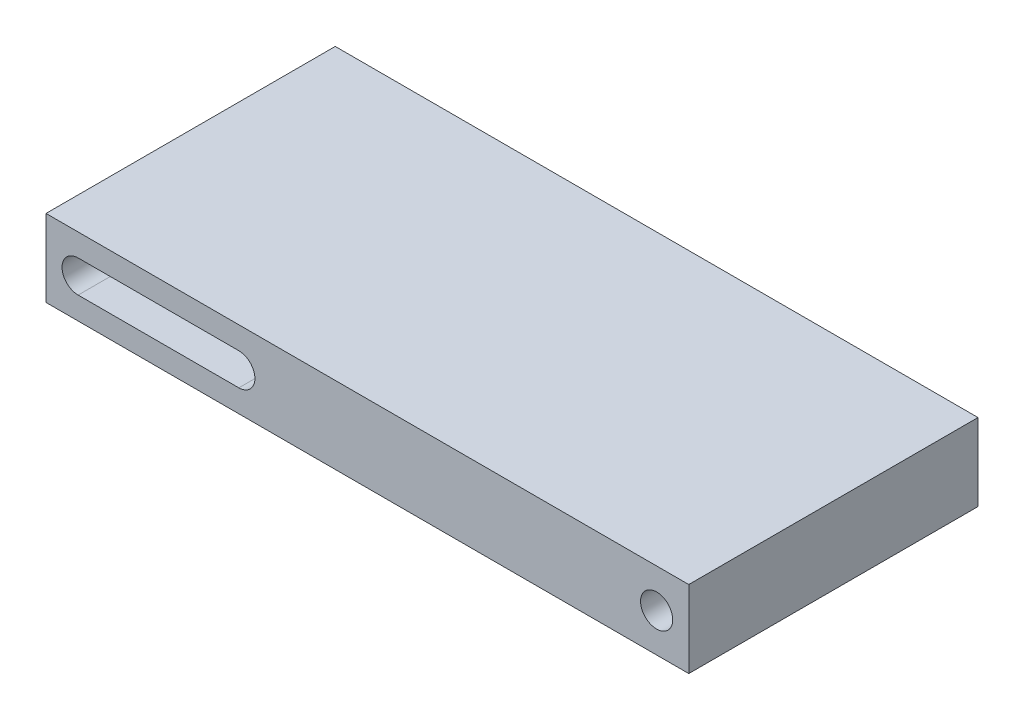
ISO-10303-21;
HEADER;
FILE_DESCRIPTION(('STEP AP214'),'2;1');
FILE_NAME('part.step','',(''),(''),'','','');
FILE_SCHEMA(('AUTOMOTIVE_DESIGN { 1 0 10303 214 1 1 1 1 }'));
ENDSEC;
DATA;
#1=APPLICATION_CONTEXT('core data for automotive mechanical design processes');
#2=APPLICATION_PROTOCOL_DEFINITION('international standard','automotive_design',2000,#1);
#3=PRODUCT_CONTEXT('',#1,'mechanical');
#4=PRODUCT('Part','Part','',(#3));
#5=PRODUCT_RELATED_PRODUCT_CATEGORY('part','',(#4));
#6=PRODUCT_DEFINITION_FORMATION('','',#4);
#7=PRODUCT_DEFINITION_CONTEXT('part definition',#1,'design');
#8=PRODUCT_DEFINITION('design','',#6,#7);
#9=PRODUCT_DEFINITION_SHAPE('','',#8);
#10=(LENGTH_UNIT() NAMED_UNIT(*) SI_UNIT(.MILLI.,.METRE.));
#11=(NAMED_UNIT(*) PLANE_ANGLE_UNIT() SI_UNIT($,.RADIAN.));
#12=(NAMED_UNIT(*) SI_UNIT($,.STERADIAN.) SOLID_ANGLE_UNIT());
#13=UNCERTAINTY_MEASURE_WITH_UNIT(LENGTH_MEASURE(1.E-05),#10,'distance_accuracy_value','');
#14=(GEOMETRIC_REPRESENTATION_CONTEXT(3) GLOBAL_UNCERTAINTY_ASSIGNED_CONTEXT((#13)) GLOBAL_UNIT_ASSIGNED_CONTEXT((#10,
#11,#12)) REPRESENTATION_CONTEXT('',''));
#15=CARTESIAN_POINT('',(0.,0.,0.));
#16=DIRECTION('',(0.,0.,1.));
#17=DIRECTION('',(1.,0.,0.));
#18=AXIS2_PLACEMENT_3D('',#15,#16,#17);
#19=CARTESIAN_POINT('',(50.,6.,-22.5));
#20=DIRECTION('',(-1.,0.,0.));
#21=DIRECTION('',(0.,0.,1.));
#22=AXIS2_PLACEMENT_3D('',#19,#20,#21);
#23=PLANE('',#22);
#24=DIRECTION('',(0.,0.,-1.));
#25=VECTOR('',#24,1.);
#26=CARTESIAN_POINT('',(50.,-6.,-22.5));
#27=LINE('',#26,#25);
#28=CARTESIAN_POINT('',(50.,-6.,22.5));
#29=VERTEX_POINT('',#28);
#30=CARTESIAN_POINT('',(50.,-6.,-22.5));
#31=VERTEX_POINT('',#30);
#32=EDGE_CURVE('E152',#29,#31,#27,.T.);
#33=ORIENTED_EDGE('',*,*,#32,.T.);
#34=DIRECTION('',(0.,-1.,0.));
#35=VECTOR('',#34,1.);
#36=CARTESIAN_POINT('',(50.,6.,-22.5));
#37=LINE('',#36,#35);
#38=CARTESIAN_POINT('',(50.,6.,-22.5));
#39=VERTEX_POINT('',#38);
#40=EDGE_CURVE('E11',#39,#31,#37,.T.);
#41=ORIENTED_EDGE('',*,*,#40,.F.);
#42=DIRECTION('',(0.,0.,-1.));
#43=VECTOR('',#42,1.);
#44=CARTESIAN_POINT('',(50.,6.,-22.5));
#45=LINE('',#44,#43);
#46=CARTESIAN_POINT('',(50.,6.,22.5));
#47=VERTEX_POINT('',#46);
#48=EDGE_CURVE('E165',#47,#39,#45,.T.);
#49=ORIENTED_EDGE('',*,*,#48,.F.);
#50=DIRECTION('',(0.,-1.,0.));
#51=VECTOR('',#50,1.);
#52=CARTESIAN_POINT('',(50.,6.,22.5));
#53=LINE('',#52,#51);
#54=EDGE_CURVE('E179',#47,#29,#53,.T.);
#55=ORIENTED_EDGE('',*,*,#54,.T.);
#56=EDGE_LOOP('',(#33,#41,#49,#55));
#57=FACE_BOUND('',#56,.T.);
#58=ADVANCED_FACE('F43',(#57),#23,.F.);
#59=CARTESIAN_POINT('',(-50.,6.,-22.5));
#60=DIRECTION('',(0.,0.,1.));
#61=DIRECTION('',(1.,0.,0.));
#62=AXIS2_PLACEMENT_3D('',#59,#60,#61);
#63=PLANE('',#62);
#64=DIRECTION('',(-1.,0.,0.));
#65=VECTOR('',#64,1.);
#66=CARTESIAN_POINT('',(-45.,2.5,-22.5));
#67=LINE('',#66,#65);
#68=CARTESIAN_POINT('',(-20.,2.5,-22.5));
#69=VERTEX_POINT('',#68);
#70=CARTESIAN_POINT('',(-45.,2.5,-22.5));
#71=VERTEX_POINT('',#70);
#72=EDGE_CURVE('E117',#69,#71,#67,.T.);
#73=ORIENTED_EDGE('',*,*,#72,.T.);
#74=CARTESIAN_POINT('',(-45.,0.,-22.5));
#75=DIRECTION('',(0.,0.,1.));
#76=DIRECTION('',(1.,0.,0.));
#77=AXIS2_PLACEMENT_3D('',#74,#75,#76);
#78=CIRCLE('',#77,2.5);
#79=CARTESIAN_POINT('',(-45.,-2.5,-22.5));
#80=VERTEX_POINT('',#79);
#81=EDGE_CURVE('E110',#71,#80,#78,.T.);
#82=ORIENTED_EDGE('',*,*,#81,.T.);
#83=DIRECTION('',(1.,0.,0.));
#84=VECTOR('',#83,1.);
#85=CARTESIAN_POINT('',(-45.,-2.5,-22.5));
#86=LINE('',#85,#84);
#87=CARTESIAN_POINT('',(-20.,-2.5,-22.5));
#88=VERTEX_POINT('',#87);
#89=EDGE_CURVE('E120',#80,#88,#86,.T.);
#90=ORIENTED_EDGE('',*,*,#89,.T.);
#91=CARTESIAN_POINT('',(-20.,0.,-22.5));
#92=DIRECTION('',(0.,0.,1.));
#93=DIRECTION('',(1.,0.,0.));
#94=AXIS2_PLACEMENT_3D('',#91,#92,#93);
#95=CIRCLE('',#94,2.5);
#96=EDGE_CURVE('E58',#88,#69,#95,.T.);
#97=ORIENTED_EDGE('',*,*,#96,.T.);
#98=EDGE_LOOP('',(#73,#82,#90,#97));
#99=FACE_BOUND('',#98,.T.);
#100=CARTESIAN_POINT('',(45.,0.,-22.5));
#101=DIRECTION('',(0.,0.,1.));
#102=DIRECTION('',(1.,0.,0.));
#103=AXIS2_PLACEMENT_3D('',#100,#101,#102);
#104=CIRCLE('',#103,2.5);
#105=CARTESIAN_POINT('',(47.5,0.,-22.5));
#106=VERTEX_POINT('',#105);
#107=EDGE_CURVE('E161',#106,#106,#104,.T.);
#108=ORIENTED_EDGE('',*,*,#107,.T.);
#109=EDGE_LOOP('',(#108));
#110=FACE_BOUND('',#109,.T.);
#111=DIRECTION('',(-1.,0.,0.));
#112=VECTOR('',#111,1.);
#113=CARTESIAN_POINT('',(-50.,-6.,-22.5));
#114=LINE('',#113,#112);
#115=CARTESIAN_POINT('',(-50.,-6.,-22.5));
#116=VERTEX_POINT('',#115);
#117=EDGE_CURVE('E183',#31,#116,#114,.T.);
#118=ORIENTED_EDGE('',*,*,#117,.T.);
#119=DIRECTION('',(0.,-1.,0.));
#120=VECTOR('',#119,1.);
#121=CARTESIAN_POINT('',(-50.,6.,-22.5));
#122=LINE('',#121,#120);
#123=CARTESIAN_POINT('',(-50.,6.,-22.5));
#124=VERTEX_POINT('',#123);
#125=EDGE_CURVE('E51',#124,#116,#122,.T.);
#126=ORIENTED_EDGE('',*,*,#125,.F.);
#127=DIRECTION('',(-1.,0.,0.));
#128=VECTOR('',#127,1.);
#129=CARTESIAN_POINT('',(-50.,6.,-22.5));
#130=LINE('',#129,#128);
#131=EDGE_CURVE('E169',#39,#124,#130,.T.);
#132=ORIENTED_EDGE('',*,*,#131,.F.);
#133=ORIENTED_EDGE('',*,*,#40,.T.);
#134=EDGE_LOOP('',(#118,#126,#132,#133));
#135=FACE_BOUND('',#134,.T.);
#136=ADVANCED_FACE('F125',(#99,#110,#135),#63,.F.);
#137=CARTESIAN_POINT('',(-50.,6.,-22.5));
#138=DIRECTION('',(1.,0.,0.));
#139=DIRECTION('',(0.,0.,-1.));
#140=AXIS2_PLACEMENT_3D('',#137,#138,#139);
#141=PLANE('',#140);
#142=DIRECTION('',(0.,0.,1.));
#143=VECTOR('',#142,1.);
#144=CARTESIAN_POINT('',(-50.,-6.,-22.5));
#145=LINE('',#144,#143);
#146=CARTESIAN_POINT('',(-50.,-6.,22.5));
#147=VERTEX_POINT('',#146);
#148=EDGE_CURVE('E186',#116,#147,#145,.T.);
#149=ORIENTED_EDGE('',*,*,#148,.T.);
#150=DIRECTION('',(0.,-1.,0.));
#151=VECTOR('',#150,1.);
#152=CARTESIAN_POINT('',(-50.,6.,22.5));
#153=LINE('',#152,#151);
#154=CARTESIAN_POINT('',(-50.,6.,22.5));
#155=VERTEX_POINT('',#154);
#156=EDGE_CURVE('E194',#155,#147,#153,.T.);
#157=ORIENTED_EDGE('',*,*,#156,.F.);
#158=DIRECTION('',(0.,0.,1.));
#159=VECTOR('',#158,1.);
#160=CARTESIAN_POINT('',(-50.,6.,-22.5));
#161=LINE('',#160,#159);
#162=EDGE_CURVE('E173',#124,#155,#161,.T.);
#163=ORIENTED_EDGE('',*,*,#162,.F.);
#164=ORIENTED_EDGE('',*,*,#125,.T.);
#165=EDGE_LOOP('',(#149,#157,#163,#164));
#166=FACE_BOUND('',#165,.T.);
#167=ADVANCED_FACE('F203',(#166),#141,.F.);
#168=CARTESIAN_POINT('',(-50.,6.,22.5));
#169=DIRECTION('',(0.,0.,-1.));
#170=DIRECTION('',(-1.,0.,0.));
#171=AXIS2_PLACEMENT_3D('',#168,#169,#170);
#172=PLANE('',#171);
#173=DIRECTION('',(1.,0.,0.));
#174=VECTOR('',#173,1.);
#175=CARTESIAN_POINT('',(-45.,-2.5,22.5));
#176=LINE('',#175,#174);
#177=CARTESIAN_POINT('',(-45.,-2.5,22.5));
#178=VERTEX_POINT('',#177);
#179=CARTESIAN_POINT('',(-20.,-2.5,22.5));
#180=VERTEX_POINT('',#179);
#181=EDGE_CURVE('E142',#178,#180,#176,.T.);
#182=ORIENTED_EDGE('',*,*,#181,.F.);
#183=CARTESIAN_POINT('',(-45.,0.,22.5));
#184=DIRECTION('',(0.,0.,1.));
#185=DIRECTION('',(1.,0.,0.));
#186=AXIS2_PLACEMENT_3D('',#183,#184,#185);
#187=CIRCLE('',#186,2.5);
#188=CARTESIAN_POINT('',(-45.,2.5,22.5));
#189=VERTEX_POINT('',#188);
#190=EDGE_CURVE('E66',#189,#178,#187,.T.);
#191=ORIENTED_EDGE('',*,*,#190,.F.);
#192=DIRECTION('',(-1.,0.,0.));
#193=VECTOR('',#192,1.);
#194=CARTESIAN_POINT('',(-45.,2.5,22.5));
#195=LINE('',#194,#193);
#196=CARTESIAN_POINT('',(-20.,2.5,22.5));
#197=VERTEX_POINT('',#196);
#198=EDGE_CURVE('E129',#197,#189,#195,.T.);
#199=ORIENTED_EDGE('',*,*,#198,.F.);
#200=CARTESIAN_POINT('',(-20.,0.,22.5));
#201=DIRECTION('',(0.,0.,1.));
#202=DIRECTION('',(1.,0.,0.));
#203=AXIS2_PLACEMENT_3D('',#200,#201,#202);
#204=CIRCLE('',#203,2.5);
#205=EDGE_CURVE('E133',#180,#197,#204,.T.);
#206=ORIENTED_EDGE('',*,*,#205,.F.);
#207=EDGE_LOOP('',(#182,#191,#199,#206));
#208=FACE_BOUND('',#207,.T.);
#209=CARTESIAN_POINT('',(45.,0.,22.5));
#210=DIRECTION('',(0.,0.,1.));
#211=DIRECTION('',(1.,0.,0.));
#212=AXIS2_PLACEMENT_3D('',#209,#210,#211);
#213=CIRCLE('',#212,2.5);
#214=CARTESIAN_POINT('',(47.5,0.,22.5));
#215=VERTEX_POINT('',#214);
#216=EDGE_CURVE('E143',#215,#215,#213,.T.);
#217=ORIENTED_EDGE('',*,*,#216,.F.);
#218=EDGE_LOOP('',(#217));
#219=FACE_BOUND('',#218,.T.);
#220=DIRECTION('',(1.,0.,0.));
#221=VECTOR('',#220,1.);
#222=CARTESIAN_POINT('',(-50.,-6.,22.5));
#223=LINE('',#222,#221);
#224=EDGE_CURVE('E170',#147,#29,#223,.T.);
#225=ORIENTED_EDGE('',*,*,#224,.T.);
#226=ORIENTED_EDGE('',*,*,#54,.F.);
#227=DIRECTION('',(1.,0.,0.));
#228=VECTOR('',#227,1.);
#229=CARTESIAN_POINT('',(-50.,6.,22.5));
#230=LINE('',#229,#228);
#231=EDGE_CURVE('E176',#155,#47,#230,.T.);
#232=ORIENTED_EDGE('',*,*,#231,.F.);
#233=ORIENTED_EDGE('',*,*,#156,.T.);
#234=EDGE_LOOP('',(#225,#226,#232,#233));
#235=FACE_BOUND('',#234,.T.);
#236=ADVANCED_FACE('F212',(#208,#219,#235),#172,.F.);
#237=CARTESIAN_POINT('',(0.,6.,0.));
#238=DIRECTION('',(0.,1.,0.));
#239=DIRECTION('',(0.,0.,1.));
#240=AXIS2_PLACEMENT_3D('',#237,#238,#239);
#241=PLANE('',#240);
#242=ORIENTED_EDGE('',*,*,#48,.T.);
#243=ORIENTED_EDGE('',*,*,#131,.T.);
#244=ORIENTED_EDGE('',*,*,#162,.T.);
#245=ORIENTED_EDGE('',*,*,#231,.T.);
#246=EDGE_LOOP('',(#242,#243,#244,#245));
#247=FACE_BOUND('',#246,.T.);
#248=ADVANCED_FACE('F218',(#247),#241,.T.);
#249=CARTESIAN_POINT('',(0.,-6.,0.));
#250=DIRECTION('',(0.,1.,0.));
#251=DIRECTION('',(0.,0.,1.));
#252=AXIS2_PLACEMENT_3D('',#249,#250,#251);
#253=PLANE('',#252);
#254=ORIENTED_EDGE('',*,*,#32,.F.);
#255=ORIENTED_EDGE('',*,*,#224,.F.);
#256=ORIENTED_EDGE('',*,*,#148,.F.);
#257=ORIENTED_EDGE('',*,*,#117,.F.);
#258=EDGE_LOOP('',(#254,#255,#256,#257));
#259=FACE_BOUND('',#258,.T.);
#260=ADVANCED_FACE('F209',(#259),#253,.F.);
#261=CARTESIAN_POINT('',(45.,0.,-22.5));
#262=DIRECTION('',(0.,0.,1.));
#263=DIRECTION('',(1.,0.,0.));
#264=AXIS2_PLACEMENT_3D('',#261,#262,#263);
#265=CYLINDRICAL_SURFACE('',#264,2.5);
#266=CARTESIAN_POINT('',(47.5,0.,-22.5));
#267=CARTESIAN_POINT('',(47.5,0.,-22.03125));
#268=CARTESIAN_POINT('',(47.5,0.,-21.5625));
#269=CARTESIAN_POINT('',(47.5,0.,-20.625));
#270=CARTESIAN_POINT('',(47.5,0.,-20.15625));
#271=CARTESIAN_POINT('',(47.5,0.,-19.21875));
#272=CARTESIAN_POINT('',(47.5,0.,-18.75));
#273=CARTESIAN_POINT('',(47.5,0.,-17.8125));
#274=CARTESIAN_POINT('',(47.5,0.,-17.34375));
#275=CARTESIAN_POINT('',(47.5,0.,-16.40625));
#276=CARTESIAN_POINT('',(47.5,0.,-15.9375));
#277=CARTESIAN_POINT('',(47.5,0.,-15.));
#278=CARTESIAN_POINT('',(47.5,0.,-14.53125));
#279=CARTESIAN_POINT('',(47.5,0.,-13.59375));
#280=CARTESIAN_POINT('',(47.5,0.,-13.125));
#281=CARTESIAN_POINT('',(47.5,0.,-12.1875));
#282=CARTESIAN_POINT('',(47.5,0.,-11.71875));
#283=CARTESIAN_POINT('',(47.5,0.,-10.78125));
#284=CARTESIAN_POINT('',(47.5,0.,-10.3125));
#285=CARTESIAN_POINT('',(47.5,0.,-9.37500000000001));
#286=CARTESIAN_POINT('',(47.5,0.,-8.90625000000001));
#287=CARTESIAN_POINT('',(47.5,0.,-7.96875000000001));
#288=CARTESIAN_POINT('',(47.5,0.,-7.50000000000001));
#289=CARTESIAN_POINT('',(47.5,0.,-6.56250000000001));
#290=CARTESIAN_POINT('',(47.5,0.,-6.09375000000001));
#291=CARTESIAN_POINT('',(47.5,0.,-5.15625000000001));
#292=CARTESIAN_POINT('',(47.5,0.,-4.68750000000001));
#293=CARTESIAN_POINT('',(47.5,0.,-3.75000000000001));
#294=CARTESIAN_POINT('',(47.5,0.,-3.28125000000001));
#295=CARTESIAN_POINT('',(47.5,0.,-2.34375000000001));
#296=CARTESIAN_POINT('',(47.5,0.,-1.87500000000001));
#297=CARTESIAN_POINT('',(47.5,0.,-0.937500000000011));
#298=CARTESIAN_POINT('',(47.5,0.,-0.468750000000011));
#299=CARTESIAN_POINT('',(47.5,0.,0.46874999999999));
#300=CARTESIAN_POINT('',(47.5,0.,0.93749999999999));
#301=CARTESIAN_POINT('',(47.5,0.,1.87499999999999));
#302=CARTESIAN_POINT('',(47.5,0.,2.34374999999999));
#303=CARTESIAN_POINT('',(47.5,0.,3.28124999999999));
#304=CARTESIAN_POINT('',(47.5,0.,3.74999999999999));
#305=CARTESIAN_POINT('',(47.5,0.,4.68749999999999));
#306=CARTESIAN_POINT('',(47.5,0.,5.15624999999999));
#307=CARTESIAN_POINT('',(47.5,0.,6.09374999999999));
#308=CARTESIAN_POINT('',(47.5,0.,6.56249999999999));
#309=CARTESIAN_POINT('',(47.5,0.,7.49999999999999));
#310=CARTESIAN_POINT('',(47.5,0.,7.96874999999999));
#311=CARTESIAN_POINT('',(47.5,0.,8.90624999999999));
#312=CARTESIAN_POINT('',(47.5,0.,9.37499999999999));
#313=CARTESIAN_POINT('',(47.5,0.,10.3125));
#314=CARTESIAN_POINT('',(47.5,0.,10.78125));
#315=CARTESIAN_POINT('',(47.5,0.,11.71875));
#316=CARTESIAN_POINT('',(47.5,0.,12.1875));
#317=CARTESIAN_POINT('',(47.5,0.,13.125));
#318=CARTESIAN_POINT('',(47.5,0.,13.59375));
#319=CARTESIAN_POINT('',(47.5,0.,14.53125));
#320=CARTESIAN_POINT('',(47.5,0.,15.));
#321=CARTESIAN_POINT('',(47.5,0.,15.9375));
#322=CARTESIAN_POINT('',(47.5,0.,16.40625));
#323=CARTESIAN_POINT('',(47.5,0.,17.34375));
#324=CARTESIAN_POINT('',(47.5,0.,17.8125));
#325=CARTESIAN_POINT('',(47.5,0.,18.75));
#326=CARTESIAN_POINT('',(47.5,0.,19.21875));
#327=CARTESIAN_POINT('',(47.5,0.,20.15625));
#328=CARTESIAN_POINT('',(47.5,0.,20.625));
#329=CARTESIAN_POINT('',(47.5,0.,21.5625));
#330=CARTESIAN_POINT('',(47.5,0.,22.03125));
#331=CARTESIAN_POINT('',(47.5,0.,22.5));
#332=B_SPLINE_CURVE_WITH_KNOTS('',3,(#266,#267,#268,#269,#270,#271,#272,#273,#274,#275,#276,
#277,#278,#279,#280,#281,#282,#283,#284,#285,#286,#287,#288,#289,#290,#291,#292,#293,#294,#295,
#296,#297,#298,#299,#300,#301,#302,#303,#304,#305,#306,#307,#308,#309,#310,#311,#312,#313,#314,
#315,#316,#317,#318,#319,#320,#321,#322,#323,#324,#325,#326,#327,#328,#329,#330,#331),
.UNSPECIFIED.,.F.,.F.,(4,2,2,2,2,2,2,2,2,2,2,2,2,2,2,2,2,2,2,2,2,2,2,2,2,2,2,2,2,2,2,2,4),(0.,
1.40625,2.8125,4.21875,5.625,7.03125,8.4375,9.84375,11.25,12.65625,14.0625,15.46875,16.875,
18.28125,19.6875,21.09375,22.5,23.90625,25.3125,26.71875,28.125,29.53125,30.9375,32.34375,33.75,
35.15625,36.5625,37.96875,39.375,40.78125,42.1875,43.59375,45.),.UNSPECIFIED.);
#333=EDGE_CURVE('BSEAM231',#106,#215,#332,.T.);
#334=ORIENTED_EDGE('',*,*,#107,.F.);
#335=ORIENTED_EDGE('',*,*,#216,.T.);
#336=ORIENTED_EDGE('',*,*,#333,.T.);
#337=ORIENTED_EDGE('',*,*,#333,.F.);
#338=EDGE_LOOP('',(#334,#336,#335,#337));
#339=FACE_BOUND('',#338,.T.);
#340=ADVANCED_FACE('F231',(#339),#265,.F.);
#341=CARTESIAN_POINT('',(-45.,0.,-22.5));
#342=DIRECTION('',(0.,0.,1.));
#343=DIRECTION('',(1.,0.,0.));
#344=AXIS2_PLACEMENT_3D('',#341,#342,#343);
#345=CYLINDRICAL_SURFACE('',#344,2.5);
#346=ORIENTED_EDGE('',*,*,#190,.T.);
#347=DIRECTION('',(0.,0.,1.));
#348=VECTOR('',#347,1.);
#349=CARTESIAN_POINT('',(-45.,-2.5,-22.5));
#350=LINE('',#349,#348);
#351=EDGE_CURVE('E106',#80,#178,#350,.T.);
#352=ORIENTED_EDGE('',*,*,#351,.F.);
#353=ORIENTED_EDGE('',*,*,#81,.F.);
#354=DIRECTION('',(0.,0.,1.));
#355=VECTOR('',#354,1.);
#356=CARTESIAN_POINT('',(-45.,2.5,-22.5));
#357=LINE('',#356,#355);
#358=EDGE_CURVE('E149',#71,#189,#357,.T.);
#359=ORIENTED_EDGE('',*,*,#358,.T.);
#360=EDGE_LOOP('',(#346,#352,#353,#359));
#361=FACE_BOUND('',#360,.T.);
#362=ADVANCED_FACE('F108',(#361),#345,.F.);
#363=CARTESIAN_POINT('',(-45.,2.5,-22.5));
#364=DIRECTION('',(0.,1.,0.));
#365=DIRECTION('',(0.,0.,1.));
#366=AXIS2_PLACEMENT_3D('',#363,#364,#365);
#367=PLANE('',#366);
#368=ORIENTED_EDGE('',*,*,#198,.T.);
#369=ORIENTED_EDGE('',*,*,#358,.F.);
#370=ORIENTED_EDGE('',*,*,#72,.F.);
#371=DIRECTION('',(0.,0.,1.));
#372=VECTOR('',#371,1.);
#373=CARTESIAN_POINT('',(-20.,2.5,-22.5));
#374=LINE('',#373,#372);
#375=EDGE_CURVE('E153',#69,#197,#374,.T.);
#376=ORIENTED_EDGE('',*,*,#375,.T.);
#377=EDGE_LOOP('',(#368,#369,#370,#376));
#378=FACE_BOUND('',#377,.T.);
#379=ADVANCED_FACE('F239',(#378),#367,.F.);
#380=CARTESIAN_POINT('',(-20.,0.,-22.5));
#381=DIRECTION('',(0.,0.,1.));
#382=DIRECTION('',(1.,0.,0.));
#383=AXIS2_PLACEMENT_3D('',#380,#381,#382);
#384=CYLINDRICAL_SURFACE('',#383,2.5);
#385=ORIENTED_EDGE('',*,*,#205,.T.);
#386=ORIENTED_EDGE('',*,*,#375,.F.);
#387=ORIENTED_EDGE('',*,*,#96,.F.);
#388=DIRECTION('',(0.,0.,1.));
#389=VECTOR('',#388,1.);
#390=CARTESIAN_POINT('',(-20.,-2.5,-22.5));
#391=LINE('',#390,#389);
#392=EDGE_CURVE('E116',#88,#180,#391,.T.);
#393=ORIENTED_EDGE('',*,*,#392,.T.);
#394=EDGE_LOOP('',(#385,#386,#387,#393));
#395=FACE_BOUND('',#394,.T.);
#396=ADVANCED_FACE('F242',(#395),#384,.F.);
#397=CARTESIAN_POINT('',(-45.,-2.5,-22.5));
#398=DIRECTION('',(0.,-1.,0.));
#399=DIRECTION('',(0.,0.,-1.));
#400=AXIS2_PLACEMENT_3D('',#397,#398,#399);
#401=PLANE('',#400);
#402=ORIENTED_EDGE('',*,*,#181,.T.);
#403=ORIENTED_EDGE('',*,*,#392,.F.);
#404=ORIENTED_EDGE('',*,*,#89,.F.);
#405=ORIENTED_EDGE('',*,*,#351,.T.);
#406=EDGE_LOOP('',(#402,#403,#404,#405));
#407=FACE_BOUND('',#406,.T.);
#408=ADVANCED_FACE('F121',(#407),#401,.F.);
#409=CLOSED_SHELL('',(#58,#136,#167,#236,#248,#260,#340,#362,#379,#396,#408));
#410=MANIFOLD_SOLID_BREP('B2',#409);
#411=ADVANCED_BREP_SHAPE_REPRESENTATION('',(#18,#410),#14);
#412=SHAPE_DEFINITION_REPRESENTATION(#9,#411);
ENDSEC;
END-ISO-10303-21;
